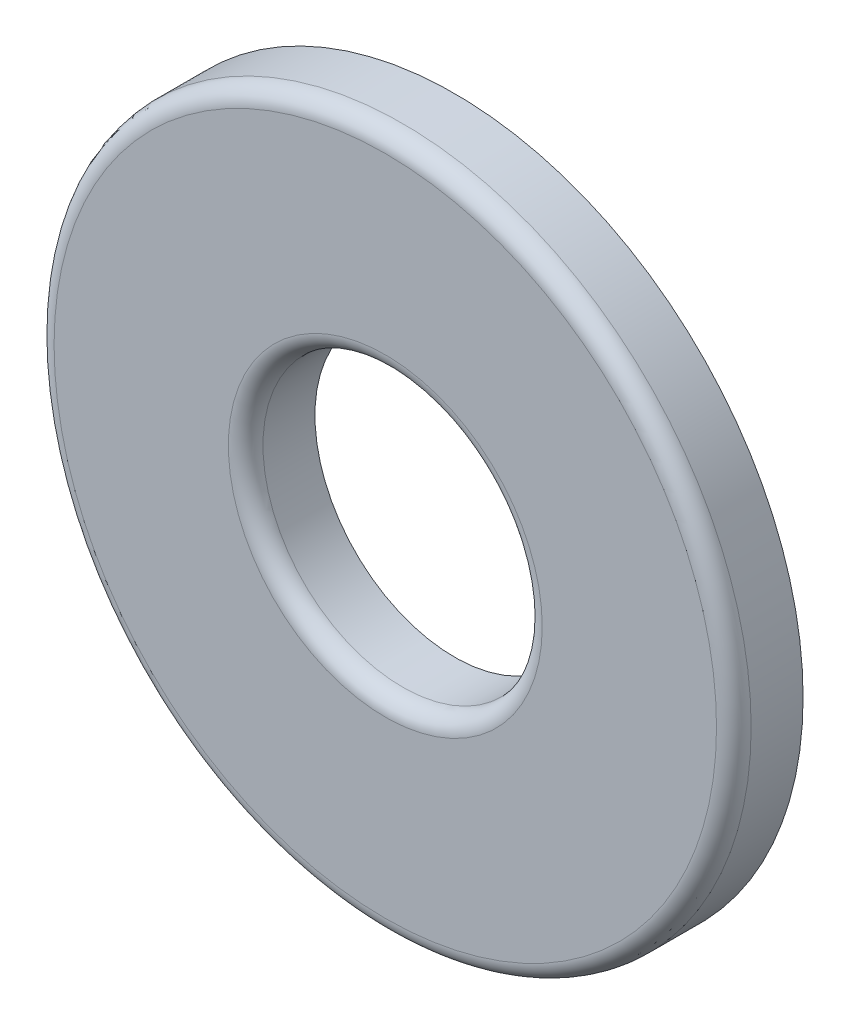
ISO-10303-21;
HEADER;
FILE_DESCRIPTION(('STEP AP214'),'2;1');
FILE_NAME('part.step','',(''),(''),'','','');
FILE_SCHEMA(('AUTOMOTIVE_DESIGN { 1 0 10303 214 1 1 1 1 }'));
ENDSEC;
DATA;
#1=APPLICATION_CONTEXT('core data for automotive mechanical design processes');
#2=APPLICATION_PROTOCOL_DEFINITION('international standard','automotive_design',2000,#1);
#3=PRODUCT_CONTEXT('',#1,'mechanical');
#4=PRODUCT('Part','Part','',(#3));
#5=PRODUCT_RELATED_PRODUCT_CATEGORY('part','',(#4));
#6=PRODUCT_DEFINITION_FORMATION('','',#4);
#7=PRODUCT_DEFINITION_CONTEXT('part definition',#1,'design');
#8=PRODUCT_DEFINITION('design','',#6,#7);
#9=PRODUCT_DEFINITION_SHAPE('','',#8);
#10=(LENGTH_UNIT() NAMED_UNIT(*) SI_UNIT(.MILLI.,.METRE.));
#11=(NAMED_UNIT(*) PLANE_ANGLE_UNIT() SI_UNIT($,.RADIAN.));
#12=(NAMED_UNIT(*) SI_UNIT($,.STERADIAN.) SOLID_ANGLE_UNIT());
#13=UNCERTAINTY_MEASURE_WITH_UNIT(LENGTH_MEASURE(1.E-05),#10,'distance_accuracy_value','');
#14=(GEOMETRIC_REPRESENTATION_CONTEXT(3) GLOBAL_UNCERTAINTY_ASSIGNED_CONTEXT((#13)) GLOBAL_UNIT_ASSIGNED_CONTEXT((#10,
#11,#12)) REPRESENTATION_CONTEXT('',''));
#15=CARTESIAN_POINT('',(0.,0.,0.));
#16=DIRECTION('',(0.,0.,1.));
#17=DIRECTION('',(1.,0.,0.));
#18=AXIS2_PLACEMENT_3D('',#15,#16,#17);
#19=CARTESIAN_POINT('',(0.,0.,0.393699999999996));
#20=DIRECTION('',(0.,0.,1.));
#21=DIRECTION('',(1.,0.,0.));
#22=AXIS2_PLACEMENT_3D('',#19,#20,#21);
#23=PLANE('',#22);
#24=CARTESIAN_POINT('',(0.,0.,0.393699999999996));
#25=DIRECTION('',(0.,0.,1.));
#26=DIRECTION('',(1.,0.,0.));
#27=AXIS2_PLACEMENT_3D('',#24,#25,#26);
#28=CIRCLE('',#27,3.76555);
#29=CARTESIAN_POINT('',(3.76555,0.,0.393699999999996));
#30=VERTEX_POINT('',#29);
#31=EDGE_CURVE('E49',#30,#30,#28,.T.);
#32=ORIENTED_EDGE('',*,*,#31,.T.);
#33=EDGE_LOOP('',(#32));
#34=FACE_BOUND('',#33,.T.);
#35=CARTESIAN_POINT('',(0.,0.,0.393699999999996));
#36=DIRECTION('',(0.,0.,1.));
#37=DIRECTION('',(1.,0.,0.));
#38=AXIS2_PLACEMENT_3D('',#35,#36,#37);
#39=CIRCLE('',#38,1.78435);
#40=CARTESIAN_POINT('',(1.78435,0.,0.393699999999996));
#41=VERTEX_POINT('',#40);
#42=EDGE_CURVE('E53',#41,#41,#39,.F.);
#43=ORIENTED_EDGE('',*,*,#42,.T.);
#44=EDGE_LOOP('',(#43));
#45=FACE_BOUND('',#44,.T.);
#46=ADVANCED_FACE('F39',(#34,#45),#23,.T.);
#47=CARTESIAN_POINT('',(0.,0.,0.393699999999996));
#48=DIRECTION('',(0.,0.,-1.));
#49=DIRECTION('',(-1.,0.,0.));
#50=AXIS2_PLACEMENT_3D('',#47,#48,#49);
#51=CYLINDRICAL_SURFACE('',#50,3.9624);
#52=CARTESIAN_POINT('',(0.,0.,0.196849999999996));
#53=DIRECTION('',(0.,0.,1.));
#54=DIRECTION('',(1.,0.,0.));
#55=AXIS2_PLACEMENT_3D('',#52,#53,#54);
#56=CIRCLE('',#55,3.9624);
#57=CARTESIAN_POINT('',(3.9624,0.,0.196849999999996));
#58=VERTEX_POINT('',#57);
#59=EDGE_CURVE('E46',#58,#58,#56,.F.);
#60=ORIENTED_EDGE('',*,*,#59,.T.);
#61=EDGE_LOOP('',(#60));
#62=FACE_BOUND('',#61,.T.);
#63=CARTESIAN_POINT('',(0.,0.,-0.393700000000004));
#64=DIRECTION('',(0.,0.,1.));
#65=DIRECTION('',(1.,0.,0.));
#66=AXIS2_PLACEMENT_3D('',#63,#64,#65);
#67=CIRCLE('',#66,3.9624);
#68=CARTESIAN_POINT('',(3.9624,0.,-0.393700000000004));
#69=VERTEX_POINT('',#68);
#70=EDGE_CURVE('E56',#69,#69,#67,.T.);
#71=ORIENTED_EDGE('',*,*,#70,.T.);
#72=EDGE_LOOP('',(#71));
#73=FACE_BOUND('',#72,.T.);
#74=ADVANCED_FACE('F72',(#62,#73),#51,.T.);
#75=CARTESIAN_POINT('',(0.,0.,0.393699999999996));
#76=DIRECTION('',(0.,0.,-1.));
#77=DIRECTION('',(-1.,0.,0.));
#78=AXIS2_PLACEMENT_3D('',#75,#76,#77);
#79=CYLINDRICAL_SURFACE('',#78,1.5875);
#80=CARTESIAN_POINT('',(0.,0.,0.196849999999996));
#81=DIRECTION('',(0.,0.,1.));
#82=DIRECTION('',(1.,0.,0.));
#83=AXIS2_PLACEMENT_3D('',#80,#81,#82);
#84=CIRCLE('',#83,1.5875);
#85=CARTESIAN_POINT('',(1.5875,0.,0.196849999999996));
#86=VERTEX_POINT('',#85);
#87=EDGE_CURVE('E10',#86,#86,#84,.T.);
#88=ORIENTED_EDGE('',*,*,#87,.T.);
#89=EDGE_LOOP('',(#88));
#90=FACE_BOUND('',#89,.T.);
#91=CARTESIAN_POINT('',(0.,0.,-0.393700000000004));
#92=DIRECTION('',(0.,0.,1.));
#93=DIRECTION('',(1.,0.,0.));
#94=AXIS2_PLACEMENT_3D('',#91,#92,#93);
#95=CIRCLE('',#94,1.5875);
#96=CARTESIAN_POINT('',(1.5875,0.,-0.393700000000004));
#97=VERTEX_POINT('',#96);
#98=EDGE_CURVE('E65',#97,#97,#95,.T.);
#99=ORIENTED_EDGE('',*,*,#98,.F.);
#100=EDGE_LOOP('',(#99));
#101=FACE_BOUND('',#100,.T.);
#102=ADVANCED_FACE('F66',(#90,#101),#79,.F.);
#103=CARTESIAN_POINT('',(0.,0.,-0.393700000000004));
#104=DIRECTION('',(0.,0.,1.));
#105=DIRECTION('',(1.,0.,0.));
#106=AXIS2_PLACEMENT_3D('',#103,#104,#105);
#107=PLANE('',#106);
#108=ORIENTED_EDGE('',*,*,#98,.T.);
#109=EDGE_LOOP('',(#108));
#110=FACE_BOUND('',#109,.T.);
#111=ORIENTED_EDGE('',*,*,#70,.F.);
#112=EDGE_LOOP('',(#111));
#113=FACE_BOUND('',#112,.T.);
#114=ADVANCED_FACE('F67',(#110,#113),#107,.F.);
#115=CARTESIAN_POINT('',(0.,0.,0.196849999999996));
#116=DIRECTION('',(0.,0.,1.));
#117=DIRECTION('',(1.,0.,0.));
#118=AXIS2_PLACEMENT_3D('',#115,#116,#117);
#119=TOROIDAL_SURFACE('',#118,3.76555,0.19685);
#120=ORIENTED_EDGE('',*,*,#59,.F.);
#121=EDGE_LOOP('',(#120));
#122=FACE_BOUND('',#121,.T.);
#123=ORIENTED_EDGE('',*,*,#31,.F.);
#124=EDGE_LOOP('',(#123));
#125=FACE_BOUND('',#124,.T.);
#126=ADVANCED_FACE('F76',(#122,#125),#119,.T.);
#127=CARTESIAN_POINT('',(0.,0.,0.196849999999996));
#128=DIRECTION('',(0.,0.,1.));
#129=DIRECTION('',(1.,0.,0.));
#130=AXIS2_PLACEMENT_3D('',#127,#128,#129);
#131=TOROIDAL_SURFACE('',#130,1.78435,0.19685);
#132=ORIENTED_EDGE('',*,*,#42,.F.);
#133=EDGE_LOOP('',(#132));
#134=FACE_BOUND('',#133,.T.);
#135=ORIENTED_EDGE('',*,*,#87,.F.);
#136=EDGE_LOOP('',(#135));
#137=FACE_BOUND('',#136,.T.);
#138=ADVANCED_FACE('F41',(#134,#137),#131,.T.);
#139=CLOSED_SHELL('',(#46,#74,#102,#114,#126,#138));
#140=MANIFOLD_SOLID_BREP('B2',#139);
#141=ADVANCED_BREP_SHAPE_REPRESENTATION('',(#18,#140),#14);
#142=SHAPE_DEFINITION_REPRESENTATION(#9,#141);
ENDSEC;
END-ISO-10303-21;
